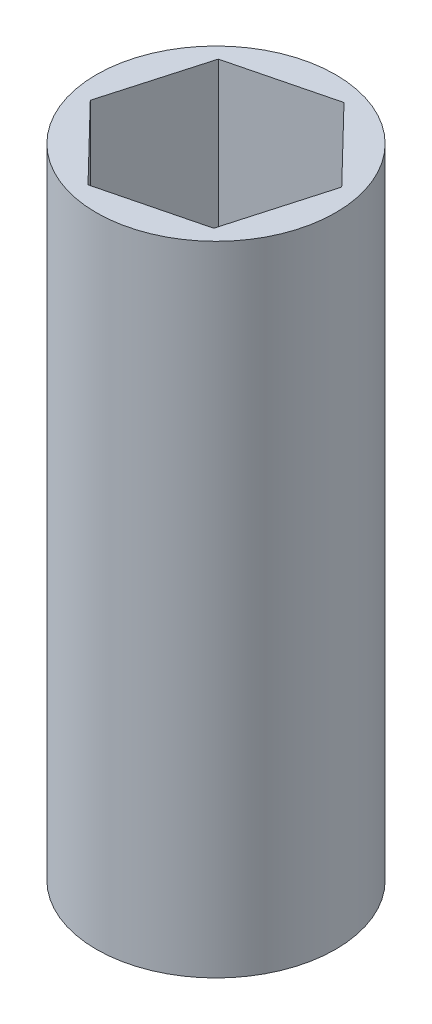
ISO-10303-21;
HEADER;
FILE_DESCRIPTION(('STEP AP214'),'2;1');
FILE_NAME('part.step','',(''),(''),'','','');
FILE_SCHEMA(('AUTOMOTIVE_DESIGN { 1 0 10303 214 1 1 1 1 }'));
ENDSEC;
DATA;
#1=APPLICATION_CONTEXT('core data for automotive mechanical design processes');
#2=APPLICATION_PROTOCOL_DEFINITION('international standard','automotive_design',2000,#1);
#3=PRODUCT_CONTEXT('',#1,'mechanical');
#4=PRODUCT('Part','Part','',(#3));
#5=PRODUCT_RELATED_PRODUCT_CATEGORY('part','',(#4));
#6=PRODUCT_DEFINITION_FORMATION('','',#4);
#7=PRODUCT_DEFINITION_CONTEXT('part definition',#1,'design');
#8=PRODUCT_DEFINITION('design','',#6,#7);
#9=PRODUCT_DEFINITION_SHAPE('','',#8);
#10=(LENGTH_UNIT() NAMED_UNIT(*) SI_UNIT(.MILLI.,.METRE.));
#11=(NAMED_UNIT(*) PLANE_ANGLE_UNIT() SI_UNIT($,.RADIAN.));
#12=(NAMED_UNIT(*) SI_UNIT($,.STERADIAN.) SOLID_ANGLE_UNIT());
#13=UNCERTAINTY_MEASURE_WITH_UNIT(LENGTH_MEASURE(1.E-05),#10,'distance_accuracy_value','');
#14=(GEOMETRIC_REPRESENTATION_CONTEXT(3) GLOBAL_UNCERTAINTY_ASSIGNED_CONTEXT((#13)) GLOBAL_UNIT_ASSIGNED_CONTEXT((#10,
#11,#12)) REPRESENTATION_CONTEXT('',''));
#15=CARTESIAN_POINT('',(0.,0.,0.));
#16=DIRECTION('',(0.,0.,1.));
#17=DIRECTION('',(1.,0.,0.));
#18=AXIS2_PLACEMENT_3D('',#15,#16,#17);
#19=CARTESIAN_POINT('',(0.,33.8666666666667,0.));
#20=DIRECTION('',(0.,1.,0.));
#21=DIRECTION('',(0.,0.,1.));
#22=AXIS2_PLACEMENT_3D('',#19,#20,#21);
#23=PLANE('',#22);
#24=CARTESIAN_POINT('',(0.,33.8666666666667,0.));
#25=DIRECTION('',(0.,1.,0.));
#26=DIRECTION('',(0.,0.,1.));
#27=AXIS2_PLACEMENT_3D('',#24,#25,#26);
#28=CIRCLE('',#27,6.35);
#29=CARTESIAN_POINT('',(0.,33.8666666666667,6.35));
#30=VERTEX_POINT('',#29);
#31=EDGE_CURVE('E11',#30,#30,#28,.T.);
#32=ORIENTED_EDGE('',*,*,#31,.T.);
#33=EDGE_LOOP('',(#32));
#34=FACE_BOUND('',#33,.T.);
#35=DIRECTION('',(-0.969830096251339,0.,0.243781837726107));
#36=VECTOR('',#35,1.);
#37=CARTESIAN_POINT('',(1.50566356257848,33.8666666666667,-5.28912584803231));
#38=LINE('',#37,#36);
#39=CARTESIAN_POINT('',(1.50566356257848,33.8666666666667,-5.28912584803231));
#40=VERTEX_POINT('',#39);
#41=CARTESIAN_POINT('',(-3.82768556691965,33.8666666666667,-3.9485058187617));
#42=VERTEX_POINT('',#41);
#43=EDGE_CURVE('E94',#40,#42,#38,.T.);
#44=ORIENTED_EDGE('',*,*,#43,.F.);
#45=DIRECTION('',(-0.696036312577735,0.,-0.718006581845313));
#46=VECTOR('',#45,1.);
#47=CARTESIAN_POINT('',(5.33334912949813,33.8666666666667,-1.34062002927061));
#48=LINE('',#47,#46);
#49=CARTESIAN_POINT('',(5.33334912949813,33.8666666666667,-1.34062002927061));
#50=VERTEX_POINT('',#49);
#51=EDGE_CURVE('E86',#50,#40,#48,.T.);
#52=ORIENTED_EDGE('',*,*,#51,.F.);
#53=DIRECTION('',(0.273793783673605,0.,-0.961788419571421));
#54=VECTOR('',#53,1.);
#55=CARTESIAN_POINT('',(3.82768556691965,33.8666666666667,3.9485058187617));
#56=LINE('',#55,#54);
#57=CARTESIAN_POINT('',(3.82768556691965,33.8666666666667,3.9485058187617));
#58=VERTEX_POINT('',#57);
#59=EDGE_CURVE('E114',#58,#50,#56,.T.);
#60=ORIENTED_EDGE('',*,*,#59,.F.);
#61=DIRECTION('',(0.969830096251339,0.,-0.243781837726108));
#62=VECTOR('',#61,1.);
#63=CARTESIAN_POINT('',(-1.50566356257847,33.8666666666667,5.28912584803231));
#64=LINE('',#63,#62);
#65=CARTESIAN_POINT('',(-1.50566356257847,33.8666666666667,5.28912584803231));
#66=VERTEX_POINT('',#65);
#67=EDGE_CURVE('E112',#66,#58,#64,.T.);
#68=ORIENTED_EDGE('',*,*,#67,.F.);
#69=DIRECTION('',(0.696036312577735,0.,0.718006581845313));
#70=VECTOR('',#69,1.);
#71=CARTESIAN_POINT('',(-5.33334912949813,33.8666666666667,1.34062002927061));
#72=LINE('',#71,#70);
#73=CARTESIAN_POINT('',(-5.33334912949813,33.8666666666667,1.34062002927061));
#74=VERTEX_POINT('',#73);
#75=EDGE_CURVE('E108',#74,#66,#72,.T.);
#76=ORIENTED_EDGE('',*,*,#75,.F.);
#77=DIRECTION('',(-0.273793783673604,0.,0.961788419571421));
#78=VECTOR('',#77,1.);
#79=CARTESIAN_POINT('',(-3.82768556691965,33.8666666666667,-3.9485058187617));
#80=LINE('',#79,#78);
#81=EDGE_CURVE('E106',#42,#74,#80,.T.);
#82=ORIENTED_EDGE('',*,*,#81,.F.);
#83=EDGE_LOOP('',(#44,#52,#60,#68,#76,#82));
#84=FACE_BOUND('',#83,.T.);
#85=ADVANCED_FACE('F33',(#34,#84),#23,.T.);
#86=CARTESIAN_POINT('',(0.,0.,0.));
#87=DIRECTION('',(0.,1.,0.));
#88=DIRECTION('',(0.,0.,1.));
#89=AXIS2_PLACEMENT_3D('',#86,#87,#88);
#90=PLANE('',#89);
#91=CARTESIAN_POINT('',(0.,0.,0.));
#92=DIRECTION('',(0.,1.,0.));
#93=DIRECTION('',(0.,0.,1.));
#94=AXIS2_PLACEMENT_3D('',#91,#92,#93);
#95=CIRCLE('',#94,6.35);
#96=CARTESIAN_POINT('',(0.,0.,6.35));
#97=VERTEX_POINT('',#96);
#98=EDGE_CURVE('E37',#97,#97,#95,.T.);
#99=ORIENTED_EDGE('',*,*,#98,.F.);
#100=EDGE_LOOP('',(#99));
#101=FACE_BOUND('',#100,.T.);
#102=DIRECTION('',(-0.696036312577735,0.,-0.718006581845313));
#103=VECTOR('',#102,1.);
#104=CARTESIAN_POINT('',(5.33334912949813,0.,-1.34062002927061));
#105=LINE('',#104,#103);
#106=CARTESIAN_POINT('',(5.33334912949813,0.,-1.34062002927061));
#107=VERTEX_POINT('',#106);
#108=CARTESIAN_POINT('',(1.50566356257848,0.,-5.28912584803231));
#109=VERTEX_POINT('',#108);
#110=EDGE_CURVE('E56',#107,#109,#105,.T.);
#111=ORIENTED_EDGE('',*,*,#110,.T.);
#112=DIRECTION('',(-0.969830096251339,0.,0.243781837726107));
#113=VECTOR('',#112,1.);
#114=CARTESIAN_POINT('',(1.50566356257848,0.,-5.28912584803231));
#115=LINE('',#114,#113);
#116=CARTESIAN_POINT('',(-3.82768556691965,0.,-3.9485058187617));
#117=VERTEX_POINT('',#116);
#118=EDGE_CURVE('E101',#109,#117,#115,.T.);
#119=ORIENTED_EDGE('',*,*,#118,.T.);
#120=DIRECTION('',(-0.273793783673604,0.,0.961788419571421));
#121=VECTOR('',#120,1.);
#122=CARTESIAN_POINT('',(-3.82768556691965,0.,-3.9485058187617));
#123=LINE('',#122,#121);
#124=CARTESIAN_POINT('',(-5.33334912949813,0.,1.34062002927061));
#125=VERTEX_POINT('',#124);
#126=EDGE_CURVE('E118',#117,#125,#123,.T.);
#127=ORIENTED_EDGE('',*,*,#126,.T.);
#128=DIRECTION('',(0.696036312577735,0.,0.718006581845313));
#129=VECTOR('',#128,1.);
#130=CARTESIAN_POINT('',(-5.33334912949813,0.,1.34062002927061));
#131=LINE('',#130,#129);
#132=CARTESIAN_POINT('',(-1.50566356257847,0.,5.28912584803231));
#133=VERTEX_POINT('',#132);
#134=EDGE_CURVE('E121',#125,#133,#131,.T.);
#135=ORIENTED_EDGE('',*,*,#134,.T.);
#136=DIRECTION('',(0.969830096251339,0.,-0.243781837726108));
#137=VECTOR('',#136,1.);
#138=CARTESIAN_POINT('',(-1.50566356257847,0.,5.28912584803231));
#139=LINE('',#138,#137);
#140=CARTESIAN_POINT('',(3.82768556691965,0.,3.9485058187617));
#141=VERTEX_POINT('',#140);
#142=EDGE_CURVE('E124',#133,#141,#139,.T.);
#143=ORIENTED_EDGE('',*,*,#142,.T.);
#144=DIRECTION('',(0.273793783673605,0.,-0.961788419571421));
#145=VECTOR('',#144,1.);
#146=CARTESIAN_POINT('',(3.82768556691965,0.,3.9485058187617));
#147=LINE('',#146,#145);
#148=EDGE_CURVE('E95',#141,#107,#147,.T.);
#149=ORIENTED_EDGE('',*,*,#148,.T.);
#150=EDGE_LOOP('',(#111,#119,#127,#135,#143,#149));
#151=FACE_BOUND('',#150,.T.);
#152=ADVANCED_FACE('F141',(#101,#151),#90,.F.);
#153=CARTESIAN_POINT('',(0.,33.8666666666667,0.));
#154=DIRECTION('',(0.,-1.,0.));
#155=DIRECTION('',(0.,0.,-1.));
#156=AXIS2_PLACEMENT_3D('',#153,#154,#155);
#157=CYLINDRICAL_SURFACE('',#156,6.35);
#158=ORIENTED_EDGE('',*,*,#31,.F.);
#159=EDGE_LOOP('',(#158));
#160=FACE_BOUND('',#159,.T.);
#161=ORIENTED_EDGE('',*,*,#98,.T.);
#162=EDGE_LOOP('',(#161));
#163=FACE_BOUND('',#162,.T.);
#164=ADVANCED_FACE('F35',(#160,#163),#157,.T.);
#165=CARTESIAN_POINT('',(5.33334912949813,33.8666666666667,-1.34062002927061));
#166=DIRECTION('',(-0.718006581845313,0.,0.696036312577735));
#167=DIRECTION('',(0.696036312577735,0.,0.718006581845313));
#168=AXIS2_PLACEMENT_3D('',#165,#166,#167);
#169=PLANE('',#168);
#170=ORIENTED_EDGE('',*,*,#110,.F.);
#171=DIRECTION('',(0.,-1.,0.));
#172=VECTOR('',#171,1.);
#173=CARTESIAN_POINT('',(5.33334912949813,33.8666666666667,-1.34062002927061));
#174=LINE('',#173,#172);
#175=EDGE_CURVE('E90',#50,#107,#174,.T.);
#176=ORIENTED_EDGE('',*,*,#175,.F.);
#177=ORIENTED_EDGE('',*,*,#51,.T.);
#178=DIRECTION('',(0.,-1.,0.));
#179=VECTOR('',#178,1.);
#180=CARTESIAN_POINT('',(1.50566356257848,33.8666666666667,-5.28912584803231));
#181=LINE('',#180,#179);
#182=EDGE_CURVE('E89',#40,#109,#181,.T.);
#183=ORIENTED_EDGE('',*,*,#182,.T.);
#184=EDGE_LOOP('',(#170,#176,#177,#183));
#185=FACE_BOUND('',#184,.T.);
#186=ADVANCED_FACE('F88',(#185),#169,.T.);
#187=CARTESIAN_POINT('',(1.50566356257848,33.8666666666667,-5.28912584803231));
#188=DIRECTION('',(0.243781837726107,0.,0.969830096251339));
#189=DIRECTION('',(0.969830096251339,0.,-0.243781837726107));
#190=AXIS2_PLACEMENT_3D('',#187,#188,#189);
#191=PLANE('',#190);
#192=ORIENTED_EDGE('',*,*,#118,.F.);
#193=ORIENTED_EDGE('',*,*,#182,.F.);
#194=ORIENTED_EDGE('',*,*,#43,.T.);
#195=DIRECTION('',(0.,-1.,0.));
#196=VECTOR('',#195,1.);
#197=CARTESIAN_POINT('',(-3.82768556691965,33.8666666666667,-3.9485058187617));
#198=LINE('',#197,#196);
#199=EDGE_CURVE('E102',#42,#117,#198,.T.);
#200=ORIENTED_EDGE('',*,*,#199,.T.);
#201=EDGE_LOOP('',(#192,#193,#194,#200));
#202=FACE_BOUND('',#201,.T.);
#203=ADVANCED_FACE('F98',(#202),#191,.T.);
#204=CARTESIAN_POINT('',(-3.82768556691965,33.8666666666667,-3.9485058187617));
#205=DIRECTION('',(0.961788419571421,0.,0.273793783673604));
#206=DIRECTION('',(0.273793783673604,0.,-0.961788419571421));
#207=AXIS2_PLACEMENT_3D('',#204,#205,#206);
#208=PLANE('',#207);
#209=ORIENTED_EDGE('',*,*,#126,.F.);
#210=ORIENTED_EDGE('',*,*,#199,.F.);
#211=ORIENTED_EDGE('',*,*,#81,.T.);
#212=DIRECTION('',(0.,-1.,0.));
#213=VECTOR('',#212,1.);
#214=CARTESIAN_POINT('',(-5.33334912949813,33.8666666666667,1.34062002927061));
#215=LINE('',#214,#213);
#216=EDGE_CURVE('E133',#74,#125,#215,.T.);
#217=ORIENTED_EDGE('',*,*,#216,.T.);
#218=EDGE_LOOP('',(#209,#210,#211,#217));
#219=FACE_BOUND('',#218,.T.);
#220=ADVANCED_FACE('F137',(#219),#208,.T.);
#221=CARTESIAN_POINT('',(-5.33334912949813,33.8666666666667,1.34062002927061));
#222=DIRECTION('',(0.718006581845313,0.,-0.696036312577735));
#223=DIRECTION('',(-0.696036312577735,0.,-0.718006581845313));
#224=AXIS2_PLACEMENT_3D('',#221,#222,#223);
#225=PLANE('',#224);
#226=ORIENTED_EDGE('',*,*,#134,.F.);
#227=ORIENTED_EDGE('',*,*,#216,.F.);
#228=ORIENTED_EDGE('',*,*,#75,.T.);
#229=DIRECTION('',(0.,-1.,0.));
#230=VECTOR('',#229,1.);
#231=CARTESIAN_POINT('',(-1.50566356257847,33.8666666666667,5.28912584803231));
#232=LINE('',#231,#230);
#233=EDGE_CURVE('E131',#66,#133,#232,.T.);
#234=ORIENTED_EDGE('',*,*,#233,.T.);
#235=EDGE_LOOP('',(#226,#227,#228,#234));
#236=FACE_BOUND('',#235,.T.);
#237=ADVANCED_FACE('F149',(#236),#225,.T.);
#238=CARTESIAN_POINT('',(-1.50566356257847,33.8666666666667,5.28912584803231));
#239=DIRECTION('',(-0.243781837726108,0.,-0.969830096251339));
#240=DIRECTION('',(-0.969830096251339,0.,0.243781837726108));
#241=AXIS2_PLACEMENT_3D('',#238,#239,#240);
#242=PLANE('',#241);
#243=ORIENTED_EDGE('',*,*,#142,.F.);
#244=ORIENTED_EDGE('',*,*,#233,.F.);
#245=ORIENTED_EDGE('',*,*,#67,.T.);
#246=DIRECTION('',(0.,-1.,0.));
#247=VECTOR('',#246,1.);
#248=CARTESIAN_POINT('',(3.82768556691965,33.8666666666667,3.9485058187617));
#249=LINE('',#248,#247);
#250=EDGE_CURVE('E48',#58,#141,#249,.T.);
#251=ORIENTED_EDGE('',*,*,#250,.T.);
#252=EDGE_LOOP('',(#243,#244,#245,#251));
#253=FACE_BOUND('',#252,.T.);
#254=ADVANCED_FACE('F147',(#253),#242,.T.);
#255=CARTESIAN_POINT('',(3.82768556691965,33.8666666666667,3.9485058187617));
#256=DIRECTION('',(-0.961788419571421,0.,-0.273793783673605));
#257=DIRECTION('',(-0.273793783673605,0.,0.961788419571421));
#258=AXIS2_PLACEMENT_3D('',#255,#256,#257);
#259=PLANE('',#258);
#260=ORIENTED_EDGE('',*,*,#148,.F.);
#261=ORIENTED_EDGE('',*,*,#250,.F.);
#262=ORIENTED_EDGE('',*,*,#59,.T.);
#263=ORIENTED_EDGE('',*,*,#175,.T.);
#264=EDGE_LOOP('',(#260,#261,#262,#263));
#265=FACE_BOUND('',#264,.T.);
#266=ADVANCED_FACE('F143',(#265),#259,.T.);
#267=CLOSED_SHELL('',(#85,#152,#164,#186,#203,#220,#237,#254,#266));
#268=MANIFOLD_SOLID_BREP('B2',#267);
#269=ADVANCED_BREP_SHAPE_REPRESENTATION('',(#18,#268),#14);
#270=SHAPE_DEFINITION_REPRESENTATION(#9,#269);
ENDSEC;
END-ISO-10303-21;
